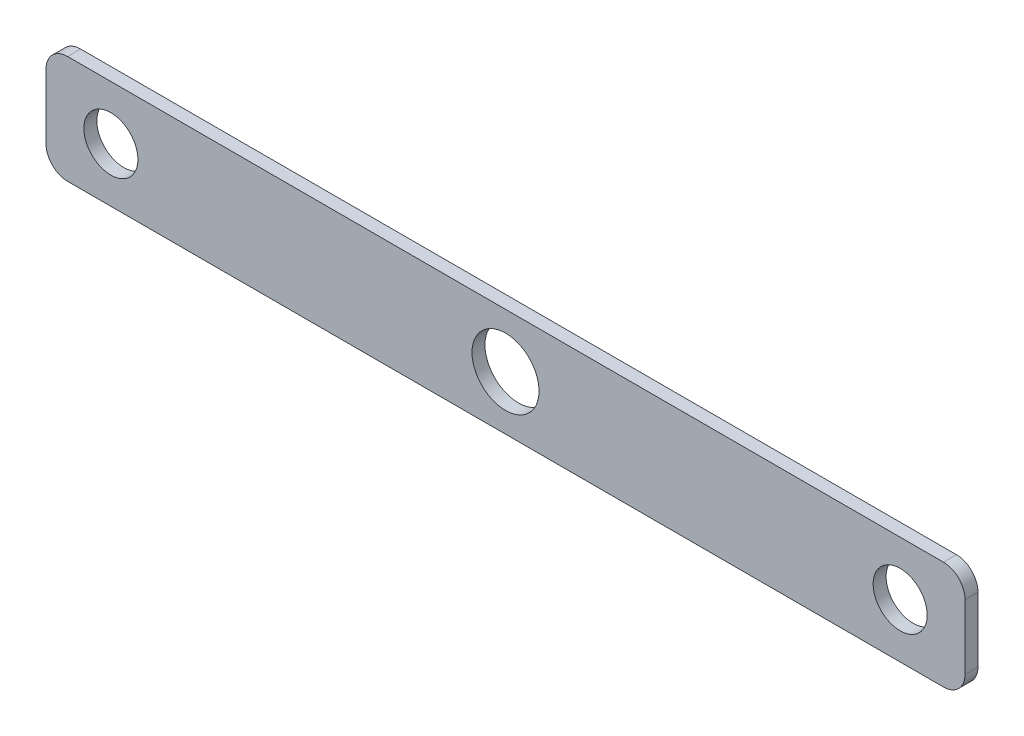
ISO-10303-21;
HEADER;
FILE_DESCRIPTION(('STEP AP214'),'2;1');
FILE_NAME('part.step','',(''),(''),'','','');
FILE_SCHEMA(('AUTOMOTIVE_DESIGN { 1 0 10303 214 1 1 1 1 }'));
ENDSEC;
DATA;
#1=APPLICATION_CONTEXT('core data for automotive mechanical design processes');
#2=APPLICATION_PROTOCOL_DEFINITION('international standard','automotive_design',2000,#1);
#3=PRODUCT_CONTEXT('',#1,'mechanical');
#4=PRODUCT('Part','Part','',(#3));
#5=PRODUCT_RELATED_PRODUCT_CATEGORY('part','',(#4));
#6=PRODUCT_DEFINITION_FORMATION('','',#4);
#7=PRODUCT_DEFINITION_CONTEXT('part definition',#1,'design');
#8=PRODUCT_DEFINITION('design','',#6,#7);
#9=PRODUCT_DEFINITION_SHAPE('','',#8);
#10=(LENGTH_UNIT() NAMED_UNIT(*) SI_UNIT(.MILLI.,.METRE.));
#11=(NAMED_UNIT(*) PLANE_ANGLE_UNIT() SI_UNIT($,.RADIAN.));
#12=(NAMED_UNIT(*) SI_UNIT($,.STERADIAN.) SOLID_ANGLE_UNIT());
#13=UNCERTAINTY_MEASURE_WITH_UNIT(LENGTH_MEASURE(1.E-05),#10,'distance_accuracy_value','');
#14=(GEOMETRIC_REPRESENTATION_CONTEXT(3) GLOBAL_UNCERTAINTY_ASSIGNED_CONTEXT((#13)) GLOBAL_UNIT_ASSIGNED_CONTEXT((#10,
#11,#12)) REPRESENTATION_CONTEXT('',''));
#15=CARTESIAN_POINT('',(0.,0.,0.));
#16=DIRECTION('',(0.,0.,1.));
#17=DIRECTION('',(1.,0.,0.));
#18=AXIS2_PLACEMENT_3D('',#15,#16,#17);
#19=CARTESIAN_POINT('',(-107.95,-12.7,1.524));
#20=DIRECTION('',(0.,0.,1.));
#21=DIRECTION('',(1.,0.,0.));
#22=AXIS2_PLACEMENT_3D('',#19,#20,#21);
#23=PLANE('',#22);
#24=CARTESIAN_POINT('',(0.,0.,1.524));
#25=DIRECTION('',(0.,0.,1.));
#26=DIRECTION('',(1.,0.,0.));
#27=AXIS2_PLACEMENT_3D('',#24,#25,#26);
#28=CIRCLE('',#27,7.87399999999997);
#29=CARTESIAN_POINT('',(-7.87399999999998,0.,1.524));
#30=VERTEX_POINT('',#29);
#31=EDGE_CURVE('E177',#30,#30,#28,.T.);
#32=ORIENTED_EDGE('',*,*,#31,.F.);
#33=EDGE_LOOP('',(#32));
#34=FACE_BOUND('',#33,.T.);
#35=DIRECTION('',(0.,1.,0.));
#36=VECTOR('',#35,1.);
#37=CARTESIAN_POINT('',(107.95,-12.7,1.524));
#38=LINE('',#37,#36);
#39=CARTESIAN_POINT('',(107.95,-7.61999999999995,1.524));
#40=VERTEX_POINT('',#39);
#41=CARTESIAN_POINT('',(107.95,7.62000000000003,1.524));
#42=VERTEX_POINT('',#41);
#43=EDGE_CURVE('E172',#40,#42,#38,.T.);
#44=ORIENTED_EDGE('',*,*,#43,.T.);
#45=CARTESIAN_POINT('',(102.87,7.62000000000002,1.524));
#46=DIRECTION('',(0.,0.,1.));
#47=DIRECTION('',(1.,0.,0.));
#48=AXIS2_PLACEMENT_3D('',#45,#46,#47);
#49=CIRCLE('',#48,5.08);
#50=CARTESIAN_POINT('',(102.87,12.7,1.524));
#51=VERTEX_POINT('',#50);
#52=EDGE_CURVE('E149',#42,#51,#49,.T.);
#53=ORIENTED_EDGE('',*,*,#52,.T.);
#54=DIRECTION('',(-1.,0.,0.));
#55=VECTOR('',#54,1.);
#56=CARTESIAN_POINT('',(107.95,12.7,1.524));
#57=LINE('',#56,#55);
#58=CARTESIAN_POINT('',(-102.87,12.7,1.524));
#59=VERTEX_POINT('',#58);
#60=EDGE_CURVE('E120',#51,#59,#57,.T.);
#61=ORIENTED_EDGE('',*,*,#60,.T.);
#62=CARTESIAN_POINT('',(-102.87,7.62000000000002,1.524));
#63=DIRECTION('',(0.,0.,1.));
#64=DIRECTION('',(1.,0.,0.));
#65=AXIS2_PLACEMENT_3D('',#62,#63,#64);
#66=CIRCLE('',#65,5.08);
#67=CARTESIAN_POINT('',(-107.95,7.62000000000001,1.524));
#68=VERTEX_POINT('',#67);
#69=EDGE_CURVE('E144',#59,#68,#66,.T.);
#70=ORIENTED_EDGE('',*,*,#69,.T.);
#71=DIRECTION('',(0.,-1.,0.));
#72=VECTOR('',#71,1.);
#73=CARTESIAN_POINT('',(-107.95,12.7,1.524));
#74=LINE('',#73,#72);
#75=CARTESIAN_POINT('',(-107.95,-7.62000000000002,1.524));
#76=VERTEX_POINT('',#75);
#77=EDGE_CURVE('E127',#68,#76,#74,.T.);
#78=ORIENTED_EDGE('',*,*,#77,.T.);
#79=CARTESIAN_POINT('',(-102.87,-7.62000000000002,1.524));
#80=DIRECTION('',(0.,0.,1.));
#81=DIRECTION('',(1.,0.,0.));
#82=AXIS2_PLACEMENT_3D('',#79,#80,#81);
#83=CIRCLE('',#82,5.08);
#84=CARTESIAN_POINT('',(-102.87,-12.7,1.524));
#85=VERTEX_POINT('',#84);
#86=EDGE_CURVE('E56',#76,#85,#83,.T.);
#87=ORIENTED_EDGE('',*,*,#86,.T.);
#88=DIRECTION('',(1.,0.,0.));
#89=VECTOR('',#88,1.);
#90=CARTESIAN_POINT('',(-107.95,-12.7,1.524));
#91=LINE('',#90,#89);
#92=CARTESIAN_POINT('',(102.87,-12.7,1.524));
#93=VERTEX_POINT('',#92);
#94=EDGE_CURVE('E130',#85,#93,#91,.T.);
#95=ORIENTED_EDGE('',*,*,#94,.T.);
#96=CARTESIAN_POINT('',(102.87,-7.61999999999999,1.524));
#97=DIRECTION('',(0.,0.,1.));
#98=DIRECTION('',(1.,0.,0.));
#99=AXIS2_PLACEMENT_3D('',#96,#97,#98);
#100=CIRCLE('',#99,5.08);
#101=EDGE_CURVE('E147',#93,#40,#100,.T.);
#102=ORIENTED_EDGE('',*,*,#101,.T.);
#103=EDGE_LOOP('',(#44,#53,#61,#70,#78,#87,#95,#102));
#104=FACE_BOUND('',#103,.T.);
#105=CARTESIAN_POINT('',(92.7100000000002,0.,1.524));
#106=DIRECTION('',(0.,0.,1.));
#107=DIRECTION('',(1.,0.,0.));
#108=AXIS2_PLACEMENT_3D('',#105,#106,#107);
#109=CIRCLE('',#108,6.35);
#110=CARTESIAN_POINT('',(86.3600000000002,0.,1.524));
#111=VERTEX_POINT('',#110);
#112=EDGE_CURVE('E165',#111,#111,#109,.T.);
#113=ORIENTED_EDGE('',*,*,#112,.F.);
#114=EDGE_LOOP('',(#113));
#115=FACE_BOUND('',#114,.T.);
#116=CARTESIAN_POINT('',(-92.7100000000001,0.,1.524));
#117=DIRECTION('',(0.,0.,1.));
#118=DIRECTION('',(1.,0.,0.));
#119=AXIS2_PLACEMENT_3D('',#116,#117,#118);
#120=CIRCLE('',#119,6.35);
#121=CARTESIAN_POINT('',(-99.0600000000001,0.,1.524));
#122=VERTEX_POINT('',#121);
#123=EDGE_CURVE('E182',#122,#122,#120,.T.);
#124=ORIENTED_EDGE('',*,*,#123,.F.);
#125=EDGE_LOOP('',(#124));
#126=FACE_BOUND('',#125,.T.);
#127=ADVANCED_FACE('F34',(#34,#104,#115,#126),#23,.T.);
#128=CARTESIAN_POINT('',(-107.95,-12.7,-1.524));
#129=DIRECTION('',(0.,0.,1.));
#130=DIRECTION('',(1.,0.,0.));
#131=AXIS2_PLACEMENT_3D('',#128,#129,#130);
#132=PLANE('',#131);
#133=CARTESIAN_POINT('',(0.,0.,-1.524));
#134=DIRECTION('',(0.,0.,1.));
#135=DIRECTION('',(1.,0.,0.));
#136=AXIS2_PLACEMENT_3D('',#133,#134,#135);
#137=CIRCLE('',#136,7.87399999999997);
#138=CARTESIAN_POINT('',(-7.87399999999998,0.,-1.524));
#139=VERTEX_POINT('',#138);
#140=EDGE_CURVE('E179',#139,#139,#137,.T.);
#141=ORIENTED_EDGE('',*,*,#140,.T.);
#142=EDGE_LOOP('',(#141));
#143=FACE_BOUND('',#142,.T.);
#144=DIRECTION('',(-1.,0.,0.));
#145=VECTOR('',#144,1.);
#146=CARTESIAN_POINT('',(107.95,12.7,-1.524));
#147=LINE('',#146,#145);
#148=CARTESIAN_POINT('',(102.87,12.7,-1.524));
#149=VERTEX_POINT('',#148);
#150=CARTESIAN_POINT('',(-102.87,12.7,-1.524));
#151=VERTEX_POINT('',#150);
#152=EDGE_CURVE('E117',#149,#151,#147,.T.);
#153=ORIENTED_EDGE('',*,*,#152,.F.);
#154=CARTESIAN_POINT('',(102.87,7.62000000000002,-1.524));
#155=DIRECTION('',(0.,0.,1.));
#156=DIRECTION('',(1.,0.,0.));
#157=AXIS2_PLACEMENT_3D('',#154,#155,#156);
#158=CIRCLE('',#157,5.08);
#159=CARTESIAN_POINT('',(107.95,7.62000000000003,-1.524));
#160=VERTEX_POINT('',#159);
#161=EDGE_CURVE('E100',#149,#160,#158,.F.);
#162=ORIENTED_EDGE('',*,*,#161,.T.);
#163=DIRECTION('',(0.,1.,0.));
#164=VECTOR('',#163,1.);
#165=CARTESIAN_POINT('',(107.95,-12.7,-1.524));
#166=LINE('',#165,#164);
#167=CARTESIAN_POINT('',(107.95,-7.61999999999995,-1.524));
#168=VERTEX_POINT('',#167);
#169=EDGE_CURVE('E128',#168,#160,#166,.T.);
#170=ORIENTED_EDGE('',*,*,#169,.F.);
#171=CARTESIAN_POINT('',(102.87,-7.61999999999999,-1.524));
#172=DIRECTION('',(0.,0.,1.));
#173=DIRECTION('',(1.,0.,0.));
#174=AXIS2_PLACEMENT_3D('',#171,#172,#173);
#175=CIRCLE('',#174,5.08);
#176=CARTESIAN_POINT('',(102.87,-12.7,-1.524));
#177=VERTEX_POINT('',#176);
#178=EDGE_CURVE('E111',#168,#177,#175,.F.);
#179=ORIENTED_EDGE('',*,*,#178,.T.);
#180=DIRECTION('',(1.,0.,0.));
#181=VECTOR('',#180,1.);
#182=CARTESIAN_POINT('',(-107.95,-12.7,-1.524));
#183=LINE('',#182,#181);
#184=CARTESIAN_POINT('',(-102.87,-12.7,-1.524));
#185=VERTEX_POINT('',#184);
#186=EDGE_CURVE('E132',#185,#177,#183,.T.);
#187=ORIENTED_EDGE('',*,*,#186,.F.);
#188=CARTESIAN_POINT('',(-102.87,-7.62000000000002,-1.524));
#189=DIRECTION('',(0.,0.,1.));
#190=DIRECTION('',(1.,0.,0.));
#191=AXIS2_PLACEMENT_3D('',#188,#189,#190);
#192=CIRCLE('',#191,5.08);
#193=CARTESIAN_POINT('',(-107.95,-7.62000000000002,-1.524));
#194=VERTEX_POINT('',#193);
#195=EDGE_CURVE('E138',#185,#194,#192,.F.);
#196=ORIENTED_EDGE('',*,*,#195,.T.);
#197=DIRECTION('',(0.,-1.,0.));
#198=VECTOR('',#197,1.);
#199=CARTESIAN_POINT('',(-107.95,12.7,-1.524));
#200=LINE('',#199,#198);
#201=CARTESIAN_POINT('',(-107.95,7.62000000000001,-1.524));
#202=VERTEX_POINT('',#201);
#203=EDGE_CURVE('E160',#202,#194,#200,.T.);
#204=ORIENTED_EDGE('',*,*,#203,.F.);
#205=CARTESIAN_POINT('',(-102.87,7.62000000000002,-1.524));
#206=DIRECTION('',(0.,0.,1.));
#207=DIRECTION('',(1.,0.,0.));
#208=AXIS2_PLACEMENT_3D('',#205,#206,#207);
#209=CIRCLE('',#208,5.08);
#210=EDGE_CURVE('E121',#202,#151,#209,.F.);
#211=ORIENTED_EDGE('',*,*,#210,.T.);
#212=EDGE_LOOP('',(#153,#162,#170,#179,#187,#196,#204,#211));
#213=FACE_BOUND('',#212,.T.);
#214=CARTESIAN_POINT('',(92.7100000000002,0.,-1.524));
#215=DIRECTION('',(0.,0.,1.));
#216=DIRECTION('',(1.,0.,0.));
#217=AXIS2_PLACEMENT_3D('',#214,#215,#216);
#218=CIRCLE('',#217,6.35);
#219=CARTESIAN_POINT('',(86.3600000000002,0.,-1.524));
#220=VERTEX_POINT('',#219);
#221=EDGE_CURVE('E168',#220,#220,#218,.T.);
#222=ORIENTED_EDGE('',*,*,#221,.T.);
#223=EDGE_LOOP('',(#222));
#224=FACE_BOUND('',#223,.T.);
#225=CARTESIAN_POINT('',(-92.7100000000001,0.,-1.524));
#226=DIRECTION('',(0.,0.,1.));
#227=DIRECTION('',(1.,0.,0.));
#228=AXIS2_PLACEMENT_3D('',#225,#226,#227);
#229=CIRCLE('',#228,6.35);
#230=CARTESIAN_POINT('',(-99.0600000000001,0.,-1.524));
#231=VERTEX_POINT('',#230);
#232=EDGE_CURVE('E185',#231,#231,#229,.T.);
#233=ORIENTED_EDGE('',*,*,#232,.T.);
#234=EDGE_LOOP('',(#233));
#235=FACE_BOUND('',#234,.T.);
#236=ADVANCED_FACE('F124',(#143,#213,#224,#235),#132,.F.);
#237=CARTESIAN_POINT('',(-107.95,12.7,1.524));
#238=DIRECTION('',(1.,0.,0.));
#239=DIRECTION('',(0.,0.,-1.));
#240=AXIS2_PLACEMENT_3D('',#237,#238,#239);
#241=PLANE('',#240);
#242=ORIENTED_EDGE('',*,*,#203,.T.);
#243=DIRECTION('',(0.,0.,-1.));
#244=VECTOR('',#243,1.);
#245=CARTESIAN_POINT('',(-107.95,-7.62000000000003,1.524));
#246=LINE('',#245,#244);
#247=EDGE_CURVE('E11',#194,#76,#246,.F.);
#248=ORIENTED_EDGE('',*,*,#247,.T.);
#249=ORIENTED_EDGE('',*,*,#77,.F.);
#250=DIRECTION('',(0.,0.,-1.));
#251=VECTOR('',#250,1.);
#252=CARTESIAN_POINT('',(-107.95,7.62000000000001,1.524));
#253=LINE('',#252,#251);
#254=EDGE_CURVE('E42',#68,#202,#253,.T.);
#255=ORIENTED_EDGE('',*,*,#254,.T.);
#256=EDGE_LOOP('',(#242,#248,#249,#255));
#257=FACE_BOUND('',#256,.T.);
#258=ADVANCED_FACE('F159',(#257),#241,.F.);
#259=CARTESIAN_POINT('',(-107.95,-12.7,1.524));
#260=DIRECTION('',(0.,1.,0.));
#261=DIRECTION('',(-1.,0.,0.));
#262=AXIS2_PLACEMENT_3D('',#259,#260,#261);
#263=PLANE('',#262);
#264=ORIENTED_EDGE('',*,*,#186,.T.);
#265=DIRECTION('',(0.,0.,-1.));
#266=VECTOR('',#265,1.);
#267=CARTESIAN_POINT('',(102.87,-12.7,1.524));
#268=LINE('',#267,#266);
#269=EDGE_CURVE('E49',#177,#93,#268,.F.);
#270=ORIENTED_EDGE('',*,*,#269,.T.);
#271=ORIENTED_EDGE('',*,*,#94,.F.);
#272=DIRECTION('',(0.,0.,-1.));
#273=VECTOR('',#272,1.);
#274=CARTESIAN_POINT('',(-102.87,-12.7,1.524));
#275=LINE('',#274,#273);
#276=EDGE_CURVE('E151',#85,#185,#275,.T.);
#277=ORIENTED_EDGE('',*,*,#276,.T.);
#278=EDGE_LOOP('',(#264,#270,#271,#277));
#279=FACE_BOUND('',#278,.T.);
#280=ADVANCED_FACE('F212',(#279),#263,.F.);
#281=CARTESIAN_POINT('',(107.95,-12.7,1.524));
#282=DIRECTION('',(-1.,0.,0.));
#283=DIRECTION('',(0.,-1.,0.));
#284=AXIS2_PLACEMENT_3D('',#281,#282,#283);
#285=PLANE('',#284);
#286=ORIENTED_EDGE('',*,*,#169,.T.);
#287=DIRECTION('',(0.,0.,-1.));
#288=VECTOR('',#287,1.);
#289=CARTESIAN_POINT('',(107.95,7.62000000000003,1.524));
#290=LINE('',#289,#288);
#291=EDGE_CURVE('E105',#160,#42,#290,.F.);
#292=ORIENTED_EDGE('',*,*,#291,.T.);
#293=ORIENTED_EDGE('',*,*,#43,.F.);
#294=DIRECTION('',(0.,0.,-1.));
#295=VECTOR('',#294,1.);
#296=CARTESIAN_POINT('',(107.95,-7.61999999999995,1.524));
#297=LINE('',#296,#295);
#298=EDGE_CURVE('E110',#40,#168,#297,.T.);
#299=ORIENTED_EDGE('',*,*,#298,.T.);
#300=EDGE_LOOP('',(#286,#292,#293,#299));
#301=FACE_BOUND('',#300,.T.);
#302=ADVANCED_FACE('F209',(#301),#285,.F.);
#303=CARTESIAN_POINT('',(107.95,12.7,1.524));
#304=DIRECTION('',(0.,-1.,0.));
#305=DIRECTION('',(1.,0.,0.));
#306=AXIS2_PLACEMENT_3D('',#303,#304,#305);
#307=PLANE('',#306);
#308=ORIENTED_EDGE('',*,*,#60,.F.);
#309=DIRECTION('',(0.,0.,-1.));
#310=VECTOR('',#309,1.);
#311=CARTESIAN_POINT('',(102.87,12.7,1.524));
#312=LINE('',#311,#310);
#313=EDGE_CURVE('E104',#51,#149,#312,.T.);
#314=ORIENTED_EDGE('',*,*,#313,.T.);
#315=ORIENTED_EDGE('',*,*,#152,.T.);
#316=DIRECTION('',(0.,0.,-1.));
#317=VECTOR('',#316,1.);
#318=CARTESIAN_POINT('',(-102.87,12.7,1.524));
#319=LINE('',#318,#317);
#320=EDGE_CURVE('E122',#151,#59,#319,.F.);
#321=ORIENTED_EDGE('',*,*,#320,.T.);
#322=EDGE_LOOP('',(#308,#314,#315,#321));
#323=FACE_BOUND('',#322,.T.);
#324=ADVANCED_FACE('F116',(#323),#307,.F.);
#325=CARTESIAN_POINT('',(92.7100000000002,0.,1.524));
#326=DIRECTION('',(0.,0.,-1.));
#327=DIRECTION('',(-1.,0.,0.));
#328=AXIS2_PLACEMENT_3D('',#325,#326,#327);
#329=CYLINDRICAL_SURFACE('',#328,6.35);
#330=CARTESIAN_POINT('',(86.3600000000002,0.,1.524));
#331=CARTESIAN_POINT('',(86.3600000000002,0.,1.49225));
#332=CARTESIAN_POINT('',(86.3600000000002,0.,1.4605));
#333=CARTESIAN_POINT('',(86.3600000000002,0.,1.397));
#334=CARTESIAN_POINT('',(86.3600000000002,0.,1.36525));
#335=CARTESIAN_POINT('',(86.3600000000002,0.,1.30175));
#336=CARTESIAN_POINT('',(86.3600000000002,0.,1.27));
#337=CARTESIAN_POINT('',(86.3600000000002,0.,1.2065));
#338=CARTESIAN_POINT('',(86.3600000000002,0.,1.17475));
#339=CARTESIAN_POINT('',(86.3600000000002,0.,1.11125));
#340=CARTESIAN_POINT('',(86.3600000000002,0.,1.0795));
#341=CARTESIAN_POINT('',(86.3600000000002,0.,1.016));
#342=CARTESIAN_POINT('',(86.3600000000002,0.,0.984249999999998));
#343=CARTESIAN_POINT('',(86.3600000000002,0.,0.920749999999998));
#344=CARTESIAN_POINT('',(86.3600000000002,0.,0.888999999999998));
#345=CARTESIAN_POINT('',(86.3600000000002,0.,0.825499999999998));
#346=CARTESIAN_POINT('',(86.3600000000002,0.,0.793749999999999));
#347=CARTESIAN_POINT('',(86.3600000000002,0.,0.730249999999999));
#348=CARTESIAN_POINT('',(86.3600000000002,0.,0.698499999999999));
#349=CARTESIAN_POINT('',(86.3600000000002,0.,0.634999999999999));
#350=CARTESIAN_POINT('',(86.3600000000002,0.,0.603249999999999));
#351=CARTESIAN_POINT('',(86.3600000000002,0.,0.539749999999999));
#352=CARTESIAN_POINT('',(86.3600000000002,0.,0.507999999999999));
#353=CARTESIAN_POINT('',(86.3600000000002,0.,0.444499999999999));
#354=CARTESIAN_POINT('',(86.3600000000002,0.,0.412749999999999));
#355=CARTESIAN_POINT('',(86.3600000000002,0.,0.349249999999999));
#356=CARTESIAN_POINT('',(86.3600000000002,0.,0.317499999999999));
#357=CARTESIAN_POINT('',(86.3600000000002,0.,0.253999999999999));
#358=CARTESIAN_POINT('',(86.3600000000002,0.,0.222249999999999));
#359=CARTESIAN_POINT('',(86.3600000000002,0.,0.158749999999999));
#360=CARTESIAN_POINT('',(86.3600000000002,0.,0.126999999999999));
#361=CARTESIAN_POINT('',(86.3600000000002,0.,0.0634999999999995));
#362=CARTESIAN_POINT('',(86.3600000000002,0.,0.0317499999999995));
#363=CARTESIAN_POINT('',(86.3600000000002,0.,-0.0317500000000004));
#364=CARTESIAN_POINT('',(86.3600000000002,0.,-0.0635000000000003));
#365=CARTESIAN_POINT('',(86.3600000000002,0.,-0.127));
#366=CARTESIAN_POINT('',(86.3600000000002,0.,-0.15875));
#367=CARTESIAN_POINT('',(86.3600000000002,0.,-0.22225));
#368=CARTESIAN_POINT('',(86.3600000000002,0.,-0.254));
#369=CARTESIAN_POINT('',(86.3600000000002,0.,-0.3175));
#370=CARTESIAN_POINT('',(86.3600000000002,0.,-0.34925));
#371=CARTESIAN_POINT('',(86.3600000000002,0.,-0.41275));
#372=CARTESIAN_POINT('',(86.3600000000002,0.,-0.444499999999999));
#373=CARTESIAN_POINT('',(86.3600000000002,0.,-0.507999999999999));
#374=CARTESIAN_POINT('',(86.3600000000002,0.,-0.539749999999999));
#375=CARTESIAN_POINT('',(86.3600000000002,0.,-0.603249999999999));
#376=CARTESIAN_POINT('',(86.3600000000002,0.,-0.634999999999999));
#377=CARTESIAN_POINT('',(86.3600000000002,0.,-0.698499999999999));
#378=CARTESIAN_POINT('',(86.3600000000002,0.,-0.730249999999999));
#379=CARTESIAN_POINT('',(86.3600000000002,0.,-0.793749999999999));
#380=CARTESIAN_POINT('',(86.3600000000002,0.,-0.825499999999999));
#381=CARTESIAN_POINT('',(86.3600000000002,0.,-0.888999999999999));
#382=CARTESIAN_POINT('',(86.3600000000002,0.,-0.920749999999999));
#383=CARTESIAN_POINT('',(86.3600000000002,0.,-0.984249999999999));
#384=CARTESIAN_POINT('',(86.3600000000002,0.,-1.016));
#385=CARTESIAN_POINT('',(86.3600000000002,0.,-1.0795));
#386=CARTESIAN_POINT('',(86.3600000000002,0.,-1.11125));
#387=CARTESIAN_POINT('',(86.3600000000002,0.,-1.17475));
#388=CARTESIAN_POINT('',(86.3600000000002,0.,-1.2065));
#389=CARTESIAN_POINT('',(86.3600000000002,0.,-1.27));
#390=CARTESIAN_POINT('',(86.3600000000002,0.,-1.30175));
#391=CARTESIAN_POINT('',(86.3600000000002,0.,-1.36525));
#392=CARTESIAN_POINT('',(86.3600000000002,0.,-1.397));
#393=CARTESIAN_POINT('',(86.3600000000002,0.,-1.4605));
#394=CARTESIAN_POINT('',(86.3600000000002,0.,-1.49225));
#395=CARTESIAN_POINT('',(86.3600000000002,0.,-1.524));
#396=B_SPLINE_CURVE_WITH_KNOTS('',3,(#330,#331,#332,#333,#334,#335,#336,#337,#338,#339,#340,
#341,#342,#343,#344,#345,#346,#347,#348,#349,#350,#351,#352,#353,#354,#355,#356,#357,#358,#359,
#360,#361,#362,#363,#364,#365,#366,#367,#368,#369,#370,#371,#372,#373,#374,#375,#376,#377,#378,
#379,#380,#381,#382,#383,#384,#385,#386,#387,#388,#389,#390,#391,#392,#393,#394,#395),
.UNSPECIFIED.,.F.,.F.,(4,2,2,2,2,2,2,2,2,2,2,2,2,2,2,2,2,2,2,2,2,2,2,2,2,2,2,2,2,2,2,2,4),(0.,
0.0952499999999998,0.1905,0.28575,0.380999999999999,0.476249999999999,0.571499999999999,
0.666749999999999,0.761999999999999,0.857249999999999,0.952499999999998,1.04775,1.143,1.23825,
1.3335,1.42875,1.524,1.61925,1.7145,1.80975,1.905,2.00025,2.0955,2.19075,2.286,2.38125,2.4765,
2.57175,2.667,2.76225,2.8575,2.95275,3.048),.UNSPECIFIED.);
#397=EDGE_CURVE('BSEAM204',#111,#220,#396,.T.);
#398=ORIENTED_EDGE('',*,*,#112,.T.);
#399=ORIENTED_EDGE('',*,*,#221,.F.);
#400=ORIENTED_EDGE('',*,*,#397,.T.);
#401=ORIENTED_EDGE('',*,*,#397,.F.);
#402=EDGE_LOOP('',(#398,#400,#399,#401));
#403=FACE_BOUND('',#402,.T.);
#404=ADVANCED_FACE('F204',(#403),#329,.F.);
#405=CARTESIAN_POINT('',(0.,0.,1.524));
#406=DIRECTION('',(0.,0.,-1.));
#407=DIRECTION('',(-1.,0.,0.));
#408=AXIS2_PLACEMENT_3D('',#405,#406,#407);
#409=CYLINDRICAL_SURFACE('',#408,7.87399999999997);
#410=CARTESIAN_POINT('',(-7.87399999999998,0.,1.524));
#411=CARTESIAN_POINT('',(-7.87399999999998,0.,1.49225));
#412=CARTESIAN_POINT('',(-7.87399999999998,0.,1.4605));
#413=CARTESIAN_POINT('',(-7.87399999999998,0.,1.397));
#414=CARTESIAN_POINT('',(-7.87399999999998,0.,1.36525));
#415=CARTESIAN_POINT('',(-7.87399999999998,0.,1.30175));
#416=CARTESIAN_POINT('',(-7.87399999999998,0.,1.27));
#417=CARTESIAN_POINT('',(-7.87399999999998,0.,1.2065));
#418=CARTESIAN_POINT('',(-7.87399999999998,0.,1.17475));
#419=CARTESIAN_POINT('',(-7.87399999999998,0.,1.11125));
#420=CARTESIAN_POINT('',(-7.87399999999998,0.,1.0795));
#421=CARTESIAN_POINT('',(-7.87399999999998,0.,1.016));
#422=CARTESIAN_POINT('',(-7.87399999999998,0.,0.984249999999998));
#423=CARTESIAN_POINT('',(-7.87399999999998,0.,0.920749999999998));
#424=CARTESIAN_POINT('',(-7.87399999999998,0.,0.888999999999998));
#425=CARTESIAN_POINT('',(-7.87399999999998,0.,0.825499999999998));
#426=CARTESIAN_POINT('',(-7.87399999999998,0.,0.793749999999999));
#427=CARTESIAN_POINT('',(-7.87399999999998,0.,0.730249999999999));
#428=CARTESIAN_POINT('',(-7.87399999999998,0.,0.698499999999999));
#429=CARTESIAN_POINT('',(-7.87399999999998,0.,0.634999999999999));
#430=CARTESIAN_POINT('',(-7.87399999999998,0.,0.603249999999999));
#431=CARTESIAN_POINT('',(-7.87399999999998,0.,0.539749999999999));
#432=CARTESIAN_POINT('',(-7.87399999999998,0.,0.507999999999999));
#433=CARTESIAN_POINT('',(-7.87399999999998,0.,0.444499999999999));
#434=CARTESIAN_POINT('',(-7.87399999999998,0.,0.412749999999999));
#435=CARTESIAN_POINT('',(-7.87399999999998,0.,0.349249999999999));
#436=CARTESIAN_POINT('',(-7.87399999999998,0.,0.317499999999999));
#437=CARTESIAN_POINT('',(-7.87399999999998,0.,0.253999999999999));
#438=CARTESIAN_POINT('',(-7.87399999999998,0.,0.222249999999999));
#439=CARTESIAN_POINT('',(-7.87399999999998,0.,0.15875));
#440=CARTESIAN_POINT('',(-7.87399999999998,0.,0.127));
#441=CARTESIAN_POINT('',(-7.87399999999998,0.,0.0634999999999997));
#442=CARTESIAN_POINT('',(-7.87399999999998,0.,0.0317499999999997));
#443=CARTESIAN_POINT('',(-7.87399999999998,0.,-0.0317500000000002));
#444=CARTESIAN_POINT('',(-7.87399999999998,0.,-0.0635000000000001));
#445=CARTESIAN_POINT('',(-7.87399999999998,0.,-0.127));
#446=CARTESIAN_POINT('',(-7.87399999999998,0.,-0.15875));
#447=CARTESIAN_POINT('',(-7.87399999999998,0.,-0.22225));
#448=CARTESIAN_POINT('',(-7.87399999999998,0.,-0.254));
#449=CARTESIAN_POINT('',(-7.87399999999998,0.,-0.3175));
#450=CARTESIAN_POINT('',(-7.87399999999998,0.,-0.34925));
#451=CARTESIAN_POINT('',(-7.87399999999998,0.,-0.41275));
#452=CARTESIAN_POINT('',(-7.87399999999998,0.,-0.444499999999999));
#453=CARTESIAN_POINT('',(-7.87399999999998,0.,-0.507999999999999));
#454=CARTESIAN_POINT('',(-7.87399999999998,0.,-0.539749999999999));
#455=CARTESIAN_POINT('',(-7.87399999999998,0.,-0.603249999999999));
#456=CARTESIAN_POINT('',(-7.87399999999998,0.,-0.634999999999999));
#457=CARTESIAN_POINT('',(-7.87399999999998,0.,-0.698499999999999));
#458=CARTESIAN_POINT('',(-7.87399999999998,0.,-0.730249999999999));
#459=CARTESIAN_POINT('',(-7.87399999999998,0.,-0.793749999999999));
#460=CARTESIAN_POINT('',(-7.87399999999998,0.,-0.825499999999999));
#461=CARTESIAN_POINT('',(-7.87399999999998,0.,-0.888999999999999));
#462=CARTESIAN_POINT('',(-7.87399999999998,0.,-0.920749999999999));
#463=CARTESIAN_POINT('',(-7.87399999999998,0.,-0.984249999999999));
#464=CARTESIAN_POINT('',(-7.87399999999998,0.,-1.016));
#465=CARTESIAN_POINT('',(-7.87399999999998,0.,-1.0795));
#466=CARTESIAN_POINT('',(-7.87399999999998,0.,-1.11125));
#467=CARTESIAN_POINT('',(-7.87399999999998,0.,-1.17475));
#468=CARTESIAN_POINT('',(-7.87399999999998,0.,-1.2065));
#469=CARTESIAN_POINT('',(-7.87399999999998,0.,-1.27));
#470=CARTESIAN_POINT('',(-7.87399999999998,0.,-1.30175));
#471=CARTESIAN_POINT('',(-7.87399999999998,0.,-1.36525));
#472=CARTESIAN_POINT('',(-7.87399999999998,0.,-1.397));
#473=CARTESIAN_POINT('',(-7.87399999999998,0.,-1.4605));
#474=CARTESIAN_POINT('',(-7.87399999999998,0.,-1.49225));
#475=CARTESIAN_POINT('',(-7.87399999999998,0.,-1.524));
#476=B_SPLINE_CURVE_WITH_KNOTS('',3,(#410,#411,#412,#413,#414,#415,#416,#417,#418,#419,#420,
#421,#422,#423,#424,#425,#426,#427,#428,#429,#430,#431,#432,#433,#434,#435,#436,#437,#438,#439,
#440,#441,#442,#443,#444,#445,#446,#447,#448,#449,#450,#451,#452,#453,#454,#455,#456,#457,#458,
#459,#460,#461,#462,#463,#464,#465,#466,#467,#468,#469,#470,#471,#472,#473,#474,#475),
.UNSPECIFIED.,.F.,.F.,(4,2,2,2,2,2,2,2,2,2,2,2,2,2,2,2,2,2,2,2,2,2,2,2,2,2,2,2,2,2,2,2,4),(0.,
0.0952500000000001,0.1905,0.28575,0.381,0.476249999999999,0.571499999999999,0.666749999999999,
0.761999999999999,0.857249999999999,0.952499999999999,1.04775,1.143,1.23825,1.3335,1.42875,
1.524,1.61925,1.7145,1.80975,1.905,2.00025,2.0955,2.19075,2.286,2.38125,2.4765,2.57175,2.667,
2.76225,2.8575,2.95275,3.048),.UNSPECIFIED.);
#477=EDGE_CURVE('BSEAM238',#30,#139,#476,.T.);
#478=ORIENTED_EDGE('',*,*,#31,.T.);
#479=ORIENTED_EDGE('',*,*,#140,.F.);
#480=ORIENTED_EDGE('',*,*,#477,.T.);
#481=ORIENTED_EDGE('',*,*,#477,.F.);
#482=EDGE_LOOP('',(#478,#480,#479,#481));
#483=FACE_BOUND('',#482,.T.);
#484=ADVANCED_FACE('F238',(#483),#409,.F.);
#485=CARTESIAN_POINT('',(-92.7100000000001,0.,1.524));
#486=DIRECTION('',(0.,0.,-1.));
#487=DIRECTION('',(-1.,0.,0.));
#488=AXIS2_PLACEMENT_3D('',#485,#486,#487);
#489=CYLINDRICAL_SURFACE('',#488,6.35);
#490=CARTESIAN_POINT('',(-99.0600000000001,0.,1.524));
#491=CARTESIAN_POINT('',(-99.0600000000001,0.,1.49225));
#492=CARTESIAN_POINT('',(-99.0600000000001,0.,1.4605));
#493=CARTESIAN_POINT('',(-99.0600000000001,0.,1.397));
#494=CARTESIAN_POINT('',(-99.0600000000001,0.,1.36525));
#495=CARTESIAN_POINT('',(-99.0600000000001,0.,1.30175));
#496=CARTESIAN_POINT('',(-99.0600000000001,0.,1.27));
#497=CARTESIAN_POINT('',(-99.0600000000001,0.,1.2065));
#498=CARTESIAN_POINT('',(-99.0600000000001,0.,1.17475));
#499=CARTESIAN_POINT('',(-99.0600000000001,0.,1.11125));
#500=CARTESIAN_POINT('',(-99.0600000000001,0.,1.0795));
#501=CARTESIAN_POINT('',(-99.0600000000001,0.,1.016));
#502=CARTESIAN_POINT('',(-99.0600000000001,0.,0.984249999999998));
#503=CARTESIAN_POINT('',(-99.0600000000001,0.,0.920749999999998));
#504=CARTESIAN_POINT('',(-99.0600000000001,0.,0.888999999999998));
#505=CARTESIAN_POINT('',(-99.0600000000001,0.,0.825499999999998));
#506=CARTESIAN_POINT('',(-99.0600000000001,0.,0.793749999999999));
#507=CARTESIAN_POINT('',(-99.0600000000001,0.,0.730249999999999));
#508=CARTESIAN_POINT('',(-99.0600000000001,0.,0.698499999999999));
#509=CARTESIAN_POINT('',(-99.0600000000001,0.,0.634999999999999));
#510=CARTESIAN_POINT('',(-99.0600000000001,0.,0.603249999999999));
#511=CARTESIAN_POINT('',(-99.0600000000001,0.,0.539749999999999));
#512=CARTESIAN_POINT('',(-99.0600000000001,0.,0.507999999999999));
#513=CARTESIAN_POINT('',(-99.0600000000001,0.,0.444499999999999));
#514=CARTESIAN_POINT('',(-99.0600000000001,0.,0.412749999999999));
#515=CARTESIAN_POINT('',(-99.0600000000001,0.,0.349249999999999));
#516=CARTESIAN_POINT('',(-99.0600000000001,0.,0.317499999999999));
#517=CARTESIAN_POINT('',(-99.0600000000001,0.,0.253999999999999));
#518=CARTESIAN_POINT('',(-99.0600000000001,0.,0.222249999999999));
#519=CARTESIAN_POINT('',(-99.0600000000001,0.,0.158749999999999));
#520=CARTESIAN_POINT('',(-99.0600000000001,0.,0.126999999999999));
#521=CARTESIAN_POINT('',(-99.0600000000001,0.,0.0634999999999995));
#522=CARTESIAN_POINT('',(-99.0600000000001,0.,0.0317499999999995));
#523=CARTESIAN_POINT('',(-99.0600000000001,0.,-0.0317500000000004));
#524=CARTESIAN_POINT('',(-99.0600000000001,0.,-0.0635000000000003));
#525=CARTESIAN_POINT('',(-99.0600000000001,0.,-0.127));
#526=CARTESIAN_POINT('',(-99.0600000000001,0.,-0.15875));
#527=CARTESIAN_POINT('',(-99.0600000000001,0.,-0.22225));
#528=CARTESIAN_POINT('',(-99.0600000000001,0.,-0.254));
#529=CARTESIAN_POINT('',(-99.0600000000001,0.,-0.3175));
#530=CARTESIAN_POINT('',(-99.0600000000001,0.,-0.34925));
#531=CARTESIAN_POINT('',(-99.0600000000001,0.,-0.41275));
#532=CARTESIAN_POINT('',(-99.0600000000001,0.,-0.444499999999999));
#533=CARTESIAN_POINT('',(-99.0600000000001,0.,-0.507999999999999));
#534=CARTESIAN_POINT('',(-99.0600000000001,0.,-0.539749999999999));
#535=CARTESIAN_POINT('',(-99.0600000000001,0.,-0.603249999999999));
#536=CARTESIAN_POINT('',(-99.0600000000001,0.,-0.634999999999999));
#537=CARTESIAN_POINT('',(-99.0600000000001,0.,-0.698499999999999));
#538=CARTESIAN_POINT('',(-99.0600000000001,0.,-0.730249999999999));
#539=CARTESIAN_POINT('',(-99.0600000000001,0.,-0.793749999999999));
#540=CARTESIAN_POINT('',(-99.0600000000001,0.,-0.825499999999999));
#541=CARTESIAN_POINT('',(-99.0600000000001,0.,-0.888999999999999));
#542=CARTESIAN_POINT('',(-99.0600000000001,0.,-0.920749999999999));
#543=CARTESIAN_POINT('',(-99.0600000000001,0.,-0.984249999999999));
#544=CARTESIAN_POINT('',(-99.0600000000001,0.,-1.016));
#545=CARTESIAN_POINT('',(-99.0600000000001,0.,-1.0795));
#546=CARTESIAN_POINT('',(-99.0600000000001,0.,-1.11125));
#547=CARTESIAN_POINT('',(-99.0600000000001,0.,-1.17475));
#548=CARTESIAN_POINT('',(-99.0600000000001,0.,-1.2065));
#549=CARTESIAN_POINT('',(-99.0600000000001,0.,-1.27));
#550=CARTESIAN_POINT('',(-99.0600000000001,0.,-1.30175));
#551=CARTESIAN_POINT('',(-99.0600000000001,0.,-1.36525));
#552=CARTESIAN_POINT('',(-99.0600000000001,0.,-1.397));
#553=CARTESIAN_POINT('',(-99.0600000000001,0.,-1.4605));
#554=CARTESIAN_POINT('',(-99.0600000000001,0.,-1.49225));
#555=CARTESIAN_POINT('',(-99.0600000000001,0.,-1.524));
#556=B_SPLINE_CURVE_WITH_KNOTS('',3,(#490,#491,#492,#493,#494,#495,#496,#497,#498,#499,#500,
#501,#502,#503,#504,#505,#506,#507,#508,#509,#510,#511,#512,#513,#514,#515,#516,#517,#518,#519,
#520,#521,#522,#523,#524,#525,#526,#527,#528,#529,#530,#531,#532,#533,#534,#535,#536,#537,#538,
#539,#540,#541,#542,#543,#544,#545,#546,#547,#548,#549,#550,#551,#552,#553,#554,#555),
.UNSPECIFIED.,.F.,.F.,(4,2,2,2,2,2,2,2,2,2,2,2,2,2,2,2,2,2,2,2,2,2,2,2,2,2,2,2,2,2,2,2,4),(0.,
0.0952499999999998,0.1905,0.28575,0.380999999999999,0.476249999999999,0.571499999999999,
0.666749999999999,0.761999999999999,0.857249999999999,0.952499999999998,1.04775,1.143,1.23825,
1.3335,1.42875,1.524,1.61925,1.7145,1.80975,1.905,2.00025,2.0955,2.19075,2.286,2.38125,2.4765,
2.57175,2.667,2.76225,2.8575,2.95275,3.048),.UNSPECIFIED.);
#557=EDGE_CURVE('BSEAM191',#122,#231,#556,.T.);
#558=ORIENTED_EDGE('',*,*,#123,.T.);
#559=ORIENTED_EDGE('',*,*,#232,.F.);
#560=ORIENTED_EDGE('',*,*,#557,.T.);
#561=ORIENTED_EDGE('',*,*,#557,.F.);
#562=EDGE_LOOP('',(#558,#560,#559,#561));
#563=FACE_BOUND('',#562,.T.);
#564=ADVANCED_FACE('F191',(#563),#489,.F.);
#565=CARTESIAN_POINT('',(102.87,7.62000000000002,1.524));
#566=DIRECTION('',(0.,0.,-1.));
#567=DIRECTION('',(-1.,0.,0.));
#568=AXIS2_PLACEMENT_3D('',#565,#566,#567);
#569=CYLINDRICAL_SURFACE('',#568,5.08);
#570=ORIENTED_EDGE('',*,*,#52,.F.);
#571=ORIENTED_EDGE('',*,*,#291,.F.);
#572=ORIENTED_EDGE('',*,*,#161,.F.);
#573=ORIENTED_EDGE('',*,*,#313,.F.);
#574=EDGE_LOOP('',(#570,#571,#572,#573));
#575=FACE_BOUND('',#574,.T.);
#576=ADVANCED_FACE('F103',(#575),#569,.T.);
#577=CARTESIAN_POINT('',(102.87,-7.61999999999999,1.524));
#578=DIRECTION('',(0.,0.,-1.));
#579=DIRECTION('',(-1.,0.,0.));
#580=AXIS2_PLACEMENT_3D('',#577,#578,#579);
#581=CYLINDRICAL_SURFACE('',#580,5.08);
#582=ORIENTED_EDGE('',*,*,#101,.F.);
#583=ORIENTED_EDGE('',*,*,#269,.F.);
#584=ORIENTED_EDGE('',*,*,#178,.F.);
#585=ORIENTED_EDGE('',*,*,#298,.F.);
#586=EDGE_LOOP('',(#582,#583,#584,#585));
#587=FACE_BOUND('',#586,.T.);
#588=ADVANCED_FACE('F220',(#587),#581,.T.);
#589=CARTESIAN_POINT('',(-102.87,-7.62000000000002,1.524));
#590=DIRECTION('',(0.,0.,-1.));
#591=DIRECTION('',(-1.,0.,0.));
#592=AXIS2_PLACEMENT_3D('',#589,#590,#591);
#593=CYLINDRICAL_SURFACE('',#592,5.08);
#594=ORIENTED_EDGE('',*,*,#86,.F.);
#595=ORIENTED_EDGE('',*,*,#247,.F.);
#596=ORIENTED_EDGE('',*,*,#195,.F.);
#597=ORIENTED_EDGE('',*,*,#276,.F.);
#598=EDGE_LOOP('',(#594,#595,#596,#597));
#599=FACE_BOUND('',#598,.T.);
#600=ADVANCED_FACE('F222',(#599),#593,.T.);
#601=CARTESIAN_POINT('',(-102.87,7.62000000000002,1.524));
#602=DIRECTION('',(0.,0.,-1.));
#603=DIRECTION('',(-1.,0.,0.));
#604=AXIS2_PLACEMENT_3D('',#601,#602,#603);
#605=CYLINDRICAL_SURFACE('',#604,5.08);
#606=ORIENTED_EDGE('',*,*,#69,.F.);
#607=ORIENTED_EDGE('',*,*,#320,.F.);
#608=ORIENTED_EDGE('',*,*,#210,.F.);
#609=ORIENTED_EDGE('',*,*,#254,.F.);
#610=EDGE_LOOP('',(#606,#607,#608,#609));
#611=FACE_BOUND('',#610,.T.);
#612=ADVANCED_FACE('F36',(#611),#605,.T.);
#613=CLOSED_SHELL('',(#127,#236,#258,#280,#302,#324,#404,#484,#564,#576,#588,#600,#612));
#614=MANIFOLD_SOLID_BREP('B2',#613);
#615=ADVANCED_BREP_SHAPE_REPRESENTATION('',(#18,#614),#14);
#616=SHAPE_DEFINITION_REPRESENTATION(#9,#615);
ENDSEC;
END-ISO-10303-21;
